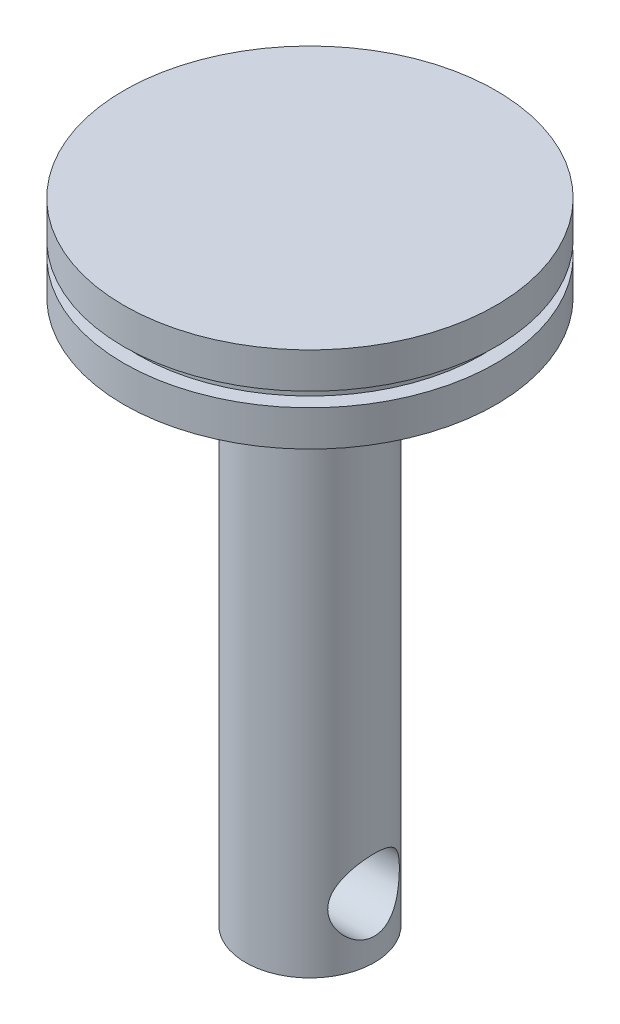
ISO-10303-21;
HEADER;
FILE_DESCRIPTION(('STEP AP214'),'2;1');
FILE_NAME('part.step','',(''),(''),'','','');
FILE_SCHEMA(('AUTOMOTIVE_DESIGN { 1 0 10303 214 1 1 1 1 }'));
ENDSEC;
DATA;
#1=APPLICATION_CONTEXT('core data for automotive mechanical design processes');
#2=APPLICATION_PROTOCOL_DEFINITION('international standard','automotive_design',2000,#1);
#3=PRODUCT_CONTEXT('',#1,'mechanical');
#4=PRODUCT('Part','Part','',(#3));
#5=PRODUCT_RELATED_PRODUCT_CATEGORY('part','',(#4));
#6=PRODUCT_DEFINITION_FORMATION('','',#4);
#7=PRODUCT_DEFINITION_CONTEXT('part definition',#1,'design');
#8=PRODUCT_DEFINITION('design','',#6,#7);
#9=PRODUCT_DEFINITION_SHAPE('','',#8);
#10=(LENGTH_UNIT() NAMED_UNIT(*) SI_UNIT(.MILLI.,.METRE.));
#11=(NAMED_UNIT(*) PLANE_ANGLE_UNIT() SI_UNIT($,.RADIAN.));
#12=(NAMED_UNIT(*) SI_UNIT($,.STERADIAN.) SOLID_ANGLE_UNIT());
#13=UNCERTAINTY_MEASURE_WITH_UNIT(LENGTH_MEASURE(1.E-05),#10,'distance_accuracy_value','');
#14=(GEOMETRIC_REPRESENTATION_CONTEXT(3) GLOBAL_UNCERTAINTY_ASSIGNED_CONTEXT((#13)) GLOBAL_UNIT_ASSIGNED_CONTEXT((#10,
#11,#12)) REPRESENTATION_CONTEXT('',''));
#15=CARTESIAN_POINT('',(0.,0.,0.));
#16=DIRECTION('',(0.,0.,1.));
#17=DIRECTION('',(1.,0.,0.));
#18=AXIS2_PLACEMENT_3D('',#15,#16,#17);
#19=CARTESIAN_POINT('',(0.,-33.9240072174427,0.));
#20=DIRECTION('',(0.,1.,0.));
#21=DIRECTION('',(0.,0.,1.));
#22=AXIS2_PLACEMENT_3D('',#19,#20,#21);
#23=CYLINDRICAL_SURFACE('',#22,4.5);
#24=CARTESIAN_POINT('',(0.,-41.9240072174427,0.));
#25=DIRECTION('',(0.,-1.,0.));
#26=DIRECTION('',(0.,0.,-1.));
#27=AXIS2_PLACEMENT_3D('',#24,#25,#26);
#28=CIRCLE('',#27,4.5);
#29=CARTESIAN_POINT('',(0.,-41.9240072174427,-4.5));
#30=VERTEX_POINT('',#29);
#31=EDGE_CURVE('E55',#30,#30,#28,.T.);
#32=ORIENTED_EDGE('',*,*,#31,.F.);
#33=EDGE_LOOP('',(#32));
#34=FACE_BOUND('',#33,.T.);
#35=CARTESIAN_POINT('',(3.74165738677394,-37.8240072174427,-2.5));
#36=CARTESIAN_POINT('',(3.7416726873018,-37.6961395570436,-2.4999886779506));
#37=CARTESIAN_POINT('',(3.74831704978973,-37.5681601848951,-2.49012046231189));
#38=CARTESIAN_POINT('',(3.77384839882003,-37.3163273203968,-2.45123834186473));
#39=CARTESIAN_POINT('',(3.7927555117257,-37.1924809633793,-2.42219296092694));
#40=CARTESIAN_POINT('',(3.83989933822706,-36.9530621004885,-2.34672518533575));
#41=CARTESIAN_POINT('',(3.86807667599456,-36.8374424908557,-2.30041313851033));
#42=CARTESIAN_POINT('',(3.93048941587976,-36.6156612164246,-2.19206578814093));
#43=CARTESIAN_POINT('',(3.96472616307529,-36.5095016594675,-2.13002699222232));
#44=CARTESIAN_POINT('',(4.03969403480013,-36.2975905020563,-1.98449846168224));
#45=CARTESIAN_POINT('',(4.08073069766828,-36.1930136394794,-1.89945493967149));
#46=CARTESIAN_POINT('',(4.16222299452639,-35.9986608869252,-1.71353751107972));
#47=CARTESIAN_POINT('',(4.20267825897363,-35.9088940607961,-1.61265398346238));
#48=CARTESIAN_POINT('',(4.28269640644694,-35.7389173849233,-1.3870985228492));
#49=CARTESIAN_POINT('',(4.3218664679031,-35.6602468877148,-1.26111369650509));
#50=CARTESIAN_POINT('',(4.39073714972017,-35.5257655540922,-0.995108431154295));
#51=CARTESIAN_POINT('',(4.4204451281028,-35.4699369454249,-0.855099010052982));
#52=CARTESIAN_POINT('',(4.46480622878589,-35.38770152924,-0.577542454411523));
#53=CARTESIAN_POINT('',(4.48051966286771,-35.3592066145069,-0.440787590455728));
#54=CARTESIAN_POINT('',(4.49916269482529,-35.3254727296973,-0.163616941001135));
#55=CARTESIAN_POINT('',(4.50210222637273,-35.3202156885494,-0.0232040856727892));
#56=CARTESIAN_POINT('',(4.4952695276662,-35.3325307137583,0.241178910719395));
#57=CARTESIAN_POINT('',(4.48682112148745,-35.3477250670809,0.365303845862469));
#58=CARTESIAN_POINT('',(4.46029652928146,-35.3961162207753,0.608906472500667));
#59=CARTESIAN_POINT('',(4.44221960111062,-35.4293144088436,0.728383805007819));
#60=CARTESIAN_POINT('',(4.39780601712422,-35.5127407223595,0.96097965319476));
#61=CARTESIAN_POINT('',(4.37138611834669,-35.5631409114613,1.07401990202965));
#62=CARTESIAN_POINT('',(4.31251997352908,-35.6791698325915,1.29025059849261));
#63=CARTESIAN_POINT('',(4.28007183515673,-35.7448033481499,1.39343793773988));
#64=CARTESIAN_POINT('',(4.20785286630511,-35.8976006789382,1.59909620965781));
#65=CARTESIAN_POINT('',(4.16766932048043,-35.9863332452798,1.70025747397735));
#66=CARTESIAN_POINT('',(4.08650106220151,-36.1786754863163,1.88703556620162));
#67=CARTESIAN_POINT('',(4.04551554284893,-36.2823008887471,1.97263574143215));
#68=CARTESIAN_POINT('',(3.96312397861105,-36.5129279257351,2.13367090095956));
#69=CARTESIAN_POINT('',(3.92201714941154,-36.6411974353891,2.2074790161184));
#70=CARTESIAN_POINT('',(3.86749177608975,-36.8433382095533,2.30082855027925));
#71=CARTESIAN_POINT('',(3.8505034104038,-36.9123543594318,2.32905476333226));
#72=CARTESIAN_POINT('',(3.81960529525348,-37.0532310078928,2.3793879141019));
#73=CARTESIAN_POINT('',(3.80569344305328,-37.1250895239277,2.4014990339696));
#74=CARTESIAN_POINT('',(3.7825660454845,-37.2652623945944,2.43774893725368));
#75=CARTESIAN_POINT('',(3.77306418691997,-37.3334015297041,2.45238335833743));
#76=CARTESIAN_POINT('',(3.75764870874585,-37.4710272751065,2.47593920496742));
#77=CARTESIAN_POINT('',(3.75173297653122,-37.5405130671281,2.48486399425826));
#78=CARTESIAN_POINT('',(3.7437735839187,-37.6801623820674,2.49684067369094));
#79=CARTESIAN_POINT('',(3.74172693637822,-37.750325340074,2.49989709455908));
#80=CARTESIAN_POINT('',(3.74159115846597,-37.890639330302,2.5000979353415));
#81=CARTESIAN_POINT('',(3.74350157370463,-37.9607903629677,2.49724303405302));
#82=CARTESIAN_POINT('',(3.75390669223115,-38.1492198810777,2.48160454093996));
#83=CARTESIAN_POINT('',(3.7660681233637,-38.2668923850021,2.46327912891111));
#84=CARTESIAN_POINT('',(3.79999671878864,-38.4970688492094,2.41059641135884));
#85=CARTESIAN_POINT('',(3.8217682717268,-38.609570422141,2.37623178080788));
#86=CARTESIAN_POINT('',(3.8734200279313,-38.8317490229989,2.29111009413922));
#87=CARTESIAN_POINT('',(3.90359765007498,-38.9411181431443,2.23973536116857));
#88=CARTESIAN_POINT('',(3.96852930897394,-39.1503329863458,2.12255957838161));
#89=CARTESIAN_POINT('',(4.00328557623677,-39.2501740266112,2.05675148683358));
#90=CARTESIAN_POINT('',(4.08021308062169,-39.4544978426964,1.90016864037281));
#91=CARTESIAN_POINT('',(4.12267224420938,-39.5571040431304,1.80707526767264));
#92=CARTESIAN_POINT('',(4.20557655948806,-39.7460065755287,1.60470900114283));
#93=CARTESIAN_POINT('',(4.24602045534201,-39.8322928288836,1.49542618309441));
#94=CARTESIAN_POINT('',(4.32300875493296,-39.9904401594782,1.25626042758287));
#95=CARTESIAN_POINT('',(4.3592262624207,-40.0612752936367,1.12558547217336));
#96=CARTESIAN_POINT('',(4.42090637895027,-40.1792035306309,0.851602165453134));
#97=CARTESIAN_POINT('',(4.44638033442814,-40.2263216915699,0.708307336575665));
#98=CARTESIAN_POINT('',(4.48148519912398,-40.2906549965625,0.42899010906301));
#99=CARTESIAN_POINT('',(4.49247473265288,-40.3104446397577,0.293732673237258));
#100=CARTESIAN_POINT('',(4.5020067452551,-40.327629618948,0.0213910904092903));
#101=CARTESIAN_POINT('',(4.50055608358422,-40.3250372958721,-0.115692008333063));
#102=CARTESIAN_POINT('',(4.48610175292531,-40.2989215921088,-0.374337460650785));
#103=CARTESIAN_POINT('',(4.47417531805916,-40.2773495756784,-0.49616574061533));
#104=CARTESIAN_POINT('',(4.44133257368086,-40.2169294998613,-0.734167155025522));
#105=CARTESIAN_POINT('',(4.42041521206198,-40.1780794185991,-0.850339625863899));
#106=CARTESIAN_POINT('',(4.37054329109129,-40.0830633418905,-1.07814775614309));
#107=CARTESIAN_POINT('',(4.34134725989101,-40.0263703932517,-1.18950897627403));
#108=CARTESIAN_POINT('',(4.27762772016495,-39.8979426400683,-1.40148896122862));
#109=CARTESIAN_POINT('',(4.24310211347579,-39.8262019074582,-1.50210346874527));
#110=CARTESIAN_POINT('',(4.16717195560101,-39.6601423971994,-1.7021791607781));
#111=CARTESIAN_POINT('',(4.12543450176894,-39.5641674438805,-1.8001424434206));
#112=CARTESIAN_POINT('',(4.04252541347579,-39.3573114005567,-1.97933250231108));
#113=CARTESIAN_POINT('',(4.0013545489803,-39.246411883079,-2.06053826881238));
#114=CARTESIAN_POINT('',(3.92122408482219,-39.0030065797889,-2.20944802239287));
#115=CARTESIAN_POINT('',(3.88262653031918,-38.8695276224798,-2.27579178691453));
#116=CARTESIAN_POINT('',(3.83343009045748,-38.6605338853563,-2.35707752273247));
#117=CARTESIAN_POINT('',(3.81848976926698,-38.589467298152,-2.3811224445757));
#118=CARTESIAN_POINT('',(3.79215325477146,-38.4448686169678,-2.42284599463621));
#119=CARTESIAN_POINT('',(3.78075483413815,-38.3713381047952,-2.44052862489737));
#120=CARTESIAN_POINT('',(3.7617084132447,-38.2194170917024,-2.4697920477666));
#121=CARTESIAN_POINT('',(3.75423236647764,-38.1409506958399,-2.48109451131779));
#122=CARTESIAN_POINT('',(3.74420222538488,-37.9830063053527,-2.49620181022554));
#123=CARTESIAN_POINT('',(3.74164787134588,-37.9035283643293,-2.50000704120456));
#124=CARTESIAN_POINT('',(3.74165738677394,-37.8240072174427,-2.5));
#125=B_SPLINE_CURVE_WITH_KNOTS('',3,(#35,#36,#37,#38,#39,#40,#41,#42,#43,#44,#45,#46,#47,#48,
#49,#50,#51,#52,#53,#54,#55,#56,#57,#58,#59,#60,#61,#62,#63,#64,#65,#66,#67,#68,#69,#70,#71,#72,
#73,#74,#75,#76,#77,#78,#79,#80,#81,#82,#83,#84,#85,#86,#87,#88,#89,#90,#91,#92,#93,#94,#95,#96,
#97,#98,#99,#100,#101,#102,#103,#104,#105,#106,#107,#108,#109,#110,#111,#112,#113,#114,#115,
#116,#117,#118,#119,#120,#121,#122,#123,#124),.UNSPECIFIED.,.T.,.F.,(4,2,2,2,2,2,2,2,2,2,2,2,2,
2,2,2,2,2,2,2,2,2,2,2,2,2,2,2,2,2,2,2,2,2,2,2,2,2,2,2,2,2,2,2,4),(0.,0.383275383121338,
0.76718141816575,1.14867490739205,1.53025318763779,1.95124472962169,2.37249297328884,
2.83086394113249,3.2888775896641,3.70817544329898,4.12714717001845,4.50138183787381,
4.87564535502261,5.25376784587462,5.63200923481063,6.05157027592399,6.47157769989119,
6.92969119559361,7.15882945779303,7.38781062115844,7.5985062155953,7.80907756727165,
8.01948627997721,8.22987083278616,8.58719279804063,8.94467811029152,9.31690871248925,
9.68932132373674,10.122176331063,10.5552977873492,11.0117233376161,11.4676656351332,
11.8767730047249,12.2856548158304,12.6568475822263,13.0280837969544,13.4115163637487,
13.7951002682315,14.2233400990621,14.6521136168463,15.1111969694139,15.3403711075502,
15.5694008362358,15.80777312205,16.0461328288286),.UNSPECIFIED.);
#126=CARTESIAN_POINT('',(3.74165738677394,-37.8240072174427,-2.5));
#127=VERTEX_POINT('',#126);
#128=EDGE_CURVE('E69',#127,#127,#125,.T.);
#129=ORIENTED_EDGE('',*,*,#128,.F.);
#130=EDGE_LOOP('',(#129));
#131=FACE_BOUND('',#130,.T.);
#132=CARTESIAN_POINT('',(-3.74165738677394,-37.8240072174427,-2.5));
#133=CARTESIAN_POINT('',(-3.7416726873018,-37.9518748778418,-2.4999886779506));
#134=CARTESIAN_POINT('',(-3.74831704978973,-38.0798542499903,-2.49012046231189));
#135=CARTESIAN_POINT('',(-3.77384839882003,-38.3316871144886,-2.45123834186473));
#136=CARTESIAN_POINT('',(-3.7927555117257,-38.4555334715061,-2.42219296092694));
#137=CARTESIAN_POINT('',(-3.83989933822706,-38.6949523343969,-2.34672518533575));
#138=CARTESIAN_POINT('',(-3.86807667599456,-38.8105719440297,-2.30041313851033));
#139=CARTESIAN_POINT('',(-3.93048941587976,-39.0323532184608,-2.19206578814093));
#140=CARTESIAN_POINT('',(-3.96472616307529,-39.1385127754179,-2.13002699222232));
#141=CARTESIAN_POINT('',(-4.03969403480013,-39.3504239328291,-1.98449846168224));
#142=CARTESIAN_POINT('',(-4.08073069766828,-39.455000795406,-1.89945493967149));
#143=CARTESIAN_POINT('',(-4.16222299452639,-39.6493535479602,-1.71353751107972));
#144=CARTESIAN_POINT('',(-4.20267825897363,-39.7391203740893,-1.61265398346238));
#145=CARTESIAN_POINT('',(-4.28269640644694,-39.9090970499621,-1.3870985228492));
#146=CARTESIAN_POINT('',(-4.3218664679031,-39.9877675471706,-1.26111369650509));
#147=CARTESIAN_POINT('',(-4.39073714972017,-40.1222488807932,-0.995108431154295));
#148=CARTESIAN_POINT('',(-4.4204451281028,-40.1780774894605,-0.855099010052982));
#149=CARTESIAN_POINT('',(-4.46480622878589,-40.2603129056454,-0.577542454411524));
#150=CARTESIAN_POINT('',(-4.48051966286771,-40.2888078203785,-0.440787590455729));
#151=CARTESIAN_POINT('',(-4.49916269482529,-40.3225417051881,-0.163616941001135));
#152=CARTESIAN_POINT('',(-4.50210222637274,-40.327798746336,-0.0232040856727894));
#153=CARTESIAN_POINT('',(-4.4952695276662,-40.3154837211271,0.241178910719395));
#154=CARTESIAN_POINT('',(-4.48682112148745,-40.3002893678045,0.365303845862469));
#155=CARTESIAN_POINT('',(-4.46029652928146,-40.2518982141101,0.608906472500667));
#156=CARTESIAN_POINT('',(-4.44221960111062,-40.2187000260418,0.728383805007819));
#157=CARTESIAN_POINT('',(-4.39780601712422,-40.1352737125259,0.96097965319476));
#158=CARTESIAN_POINT('',(-4.37138611834669,-40.0848735234241,1.07401990202965));
#159=CARTESIAN_POINT('',(-4.31251997352908,-39.9688446022939,1.29025059849261));
#160=CARTESIAN_POINT('',(-4.28007183515673,-39.9032110867355,1.39343793773988));
#161=CARTESIAN_POINT('',(-4.20785286630511,-39.7504137559472,1.59909620965781));
#162=CARTESIAN_POINT('',(-4.16766932048043,-39.6616811896056,1.70025747397735));
#163=CARTESIAN_POINT('',(-4.08650106220151,-39.4693389485691,1.88703556620162));
#164=CARTESIAN_POINT('',(-4.04551554284893,-39.3657135461383,1.97263574143215));
#165=CARTESIAN_POINT('',(-3.96312397861105,-39.1350865091503,2.13367090095956));
#166=CARTESIAN_POINT('',(-3.92201714941154,-39.0068169994963,2.2074790161184));
#167=CARTESIAN_POINT('',(-3.86749177608975,-38.8046762253321,2.30082855027925));
#168=CARTESIAN_POINT('',(-3.8505034104038,-38.7356600754536,2.32905476333226));
#169=CARTESIAN_POINT('',(-3.81960529525348,-38.5947834269926,2.3793879141019));
#170=CARTESIAN_POINT('',(-3.80569344305328,-38.5229249109577,2.4014990339696));
#171=CARTESIAN_POINT('',(-3.7825660454845,-38.382752040291,2.43774893725368));
#172=CARTESIAN_POINT('',(-3.77306418691998,-38.3146129051813,2.45238335833743));
#173=CARTESIAN_POINT('',(-3.75764870874585,-38.1769871597789,2.47593920496742));
#174=CARTESIAN_POINT('',(-3.75173297653122,-38.1075013677573,2.48486399425826));
#175=CARTESIAN_POINT('',(-3.7437735839187,-37.967852052818,2.49684067369094));
#176=CARTESIAN_POINT('',(-3.74172693637822,-37.8976890948114,2.49989709455908));
#177=CARTESIAN_POINT('',(-3.74159115846598,-37.7573751045834,2.5000979353415));
#178=CARTESIAN_POINT('',(-3.74350157370463,-37.6872240719177,2.49724303405302));
#179=CARTESIAN_POINT('',(-3.75390669223115,-37.4987945538077,2.48160454093996));
#180=CARTESIAN_POINT('',(-3.7660681233637,-37.3811220498833,2.46327912891111));
#181=CARTESIAN_POINT('',(-3.79999671878864,-37.150945585676,2.41059641135884));
#182=CARTESIAN_POINT('',(-3.8217682717268,-37.0384440127444,2.37623178080788));
#183=CARTESIAN_POINT('',(-3.8734200279313,-36.8162654118865,2.29111009413922));
#184=CARTESIAN_POINT('',(-3.90359765007498,-36.7068962917411,2.23973536116857));
#185=CARTESIAN_POINT('',(-3.96852930897394,-36.4976814485396,2.12255957838161));
#186=CARTESIAN_POINT('',(-4.00328557623677,-36.3978404082742,2.05675148683358));
#187=CARTESIAN_POINT('',(-4.08021308062169,-36.193516592189,1.90016864037281));
#188=CARTESIAN_POINT('',(-4.12267224420938,-36.090910391755,1.80707526767264));
#189=CARTESIAN_POINT('',(-4.20557655948806,-35.9020078593567,1.60470900114283));
#190=CARTESIAN_POINT('',(-4.24602045534201,-35.8157216060018,1.49542618309441));
#191=CARTESIAN_POINT('',(-4.32300875493296,-35.6575742754072,1.25626042758287));
#192=CARTESIAN_POINT('',(-4.3592262624207,-35.5867391412487,1.12558547217336));
#193=CARTESIAN_POINT('',(-4.42090637895027,-35.4688109042545,0.851602165453132));
#194=CARTESIAN_POINT('',(-4.44638033442814,-35.4216927433155,0.708307336575663));
#195=CARTESIAN_POINT('',(-4.48148519912398,-35.3573594383229,0.42899010906301));
#196=CARTESIAN_POINT('',(-4.49247473265288,-35.3375697951277,0.293732673237258));
#197=CARTESIAN_POINT('',(-4.5020067452551,-35.3203848159374,0.0213910904092904));
#198=CARTESIAN_POINT('',(-4.50055608358422,-35.3229771390133,-0.115692008333063));
#199=CARTESIAN_POINT('',(-4.48610175292531,-35.3490928427766,-0.374337460650785));
#200=CARTESIAN_POINT('',(-4.47417531805916,-35.370664859207,-0.49616574061533));
#201=CARTESIAN_POINT('',(-4.44133257368086,-35.4310849350241,-0.734167155025522));
#202=CARTESIAN_POINT('',(-4.42041521206198,-35.4699350162863,-0.850339625863899));
#203=CARTESIAN_POINT('',(-4.37054329109129,-35.5649510929949,-1.07814775614309));
#204=CARTESIAN_POINT('',(-4.34134725989101,-35.6216440416337,-1.18950897627403));
#205=CARTESIAN_POINT('',(-4.27762772016495,-35.7500717948171,-1.40148896122862));
#206=CARTESIAN_POINT('',(-4.24310211347579,-35.8218125274272,-1.50210346874527));
#207=CARTESIAN_POINT('',(-4.16717195560101,-35.987872037686,-1.7021791607781));
#208=CARTESIAN_POINT('',(-4.12543450176894,-36.0838469910049,-1.8001424434206));
#209=CARTESIAN_POINT('',(-4.04252541347578,-36.2907030343287,-1.97933250231108));
#210=CARTESIAN_POINT('',(-4.0013545489803,-36.4016025518064,-2.06053826881238));
#211=CARTESIAN_POINT('',(-3.92122408482219,-36.6450078550965,-2.20944802239287));
#212=CARTESIAN_POINT('',(-3.88262653031918,-36.7784868124057,-2.27579178691453));
#213=CARTESIAN_POINT('',(-3.83343009045748,-36.9874805495291,-2.35707752273247));
#214=CARTESIAN_POINT('',(-3.81848976926698,-37.0585471367334,-2.3811224445757));
#215=CARTESIAN_POINT('',(-3.79215325477146,-37.2031458179176,-2.42284599463621));
#216=CARTESIAN_POINT('',(-3.78075483413815,-37.2766763300902,-2.44052862489737));
#217=CARTESIAN_POINT('',(-3.7617084132447,-37.428597343183,-2.4697920477666));
#218=CARTESIAN_POINT('',(-3.75423236647764,-37.5070637390455,-2.48109451131779));
#219=CARTESIAN_POINT('',(-3.74420222538488,-37.6650081295327,-2.49620181022554));
#220=CARTESIAN_POINT('',(-3.74164787134588,-37.7444860705561,-2.50000704120456));
#221=CARTESIAN_POINT('',(-3.74165738677394,-37.8240072174427,-2.5));
#222=B_SPLINE_CURVE_WITH_KNOTS('',3,(#132,#133,#134,#135,#136,#137,#138,#139,#140,#141,#142,
#143,#144,#145,#146,#147,#148,#149,#150,#151,#152,#153,#154,#155,#156,#157,#158,#159,#160,#161,
#162,#163,#164,#165,#166,#167,#168,#169,#170,#171,#172,#173,#174,#175,#176,#177,#178,#179,#180,
#181,#182,#183,#184,#185,#186,#187,#188,#189,#190,#191,#192,#193,#194,#195,#196,#197,#198,#199,
#200,#201,#202,#203,#204,#205,#206,#207,#208,#209,#210,#211,#212,#213,#214,#215,#216,#217,#218,
#219,#220,#221),.UNSPECIFIED.,.T.,.F.,(4,2,2,2,2,2,2,2,2,2,2,2,2,2,2,2,2,2,2,2,2,2,2,2,2,2,2,2,
2,2,2,2,2,2,2,2,2,2,2,2,2,2,2,2,4),(0.,0.383275383121338,0.76718141816575,1.14867490739205,
1.53025318763779,1.95124472962169,2.37249297328884,2.83086394113249,3.2888775896641,
3.70817544329898,4.12714717001845,4.50138183787381,4.87564535502261,5.25376784587462,
5.63200923481063,6.05157027592398,6.47157769989119,6.92969119559361,7.15882945779303,
7.38781062115844,7.59850621559528,7.80907756727165,8.01948627997722,8.22987083278616,
8.58719279804062,8.94467811029152,9.31690871248924,9.68932132373674,10.122176331063,
10.5552977873492,11.0117233376161,11.4676656351332,11.8767730047249,12.2856548158304,
12.6568475822263,13.0280837969544,13.4115163637487,13.7951002682315,14.2233400990621,
14.6521136168463,15.1111969694139,15.3403711075502,15.5694008362358,15.80777312205,
16.0461328288286),.UNSPECIFIED.);
#223=CARTESIAN_POINT('',(-3.74165738677394,-37.8240072174427,-2.5));
#224=VERTEX_POINT('',#223);
#225=EDGE_CURVE('E37',#224,#224,#222,.T.);
#226=ORIENTED_EDGE('',*,*,#225,.F.);
#227=EDGE_LOOP('',(#226));
#228=FACE_BOUND('',#227,.T.);
#229=CARTESIAN_POINT('',(0.,-3.9240072174427,0.));
#230=DIRECTION('',(0.,-1.,0.));
#231=DIRECTION('',(0.,0.,-1.));
#232=AXIS2_PLACEMENT_3D('',#229,#230,#231);
#233=CIRCLE('',#232,4.5);
#234=CARTESIAN_POINT('',(0.,-3.9240072174427,-4.5));
#235=VERTEX_POINT('',#234);
#236=EDGE_CURVE('E10',#235,#235,#233,.T.);
#237=ORIENTED_EDGE('',*,*,#236,.T.);
#238=EDGE_LOOP('',(#237));
#239=FACE_BOUND('',#238,.T.);
#240=ADVANCED_FACE('F33',(#34,#131,#228,#239),#23,.T.);
#241=CARTESIAN_POINT('',(0.,2.0759927825573,0.));
#242=DIRECTION('',(0.,-1.,0.));
#243=DIRECTION('',(0.,0.,-1.));
#244=AXIS2_PLACEMENT_3D('',#241,#242,#243);
#245=PLANE('',#244);
#246=CARTESIAN_POINT('',(0.,2.0759927825573,0.));
#247=DIRECTION('',(0.,1.,0.));
#248=DIRECTION('',(0.,0.,1.));
#249=AXIS2_PLACEMENT_3D('',#246,#247,#248);
#250=CIRCLE('',#249,13.);
#251=CARTESIAN_POINT('',(0.,2.0759927825573,13.));
#252=VERTEX_POINT('',#251);
#253=EDGE_CURVE('E46',#252,#252,#250,.T.);
#254=ORIENTED_EDGE('',*,*,#253,.T.);
#255=EDGE_LOOP('',(#254));
#256=FACE_BOUND('',#255,.T.);
#257=ADVANCED_FACE('F35',(#256),#245,.F.);
#258=CARTESIAN_POINT('',(0.,49.3119209927505,0.));
#259=DIRECTION('',(0.,1.,0.));
#260=DIRECTION('',(0.,0.,1.));
#261=AXIS2_PLACEMENT_3D('',#258,#259,#260);
#262=CYLINDRICAL_SURFACE('',#261,13.);
#263=ORIENTED_EDGE('',*,*,#253,.F.);
#264=EDGE_LOOP('',(#263));
#265=FACE_BOUND('',#264,.T.);
#266=CARTESIAN_POINT('',(0.,-0.4240072174427,0.));
#267=DIRECTION('',(0.,1.,0.));
#268=DIRECTION('',(0.,0.,1.));
#269=AXIS2_PLACEMENT_3D('',#266,#267,#268);
#270=CIRCLE('',#269,13.);
#271=CARTESIAN_POINT('',(0.,-0.4240072174427,13.));
#272=VERTEX_POINT('',#271);
#273=EDGE_CURVE('E51',#272,#272,#270,.T.);
#274=ORIENTED_EDGE('',*,*,#273,.T.);
#275=EDGE_LOOP('',(#274));
#276=FACE_BOUND('',#275,.T.);
#277=ADVANCED_FACE('F97',(#265,#276),#262,.T.);
#278=CARTESIAN_POINT('',(12.,-0.424007217442703,0.));
#279=DIRECTION('',(0.,1.,0.));
#280=DIRECTION('',(0.,0.,1.));
#281=AXIS2_PLACEMENT_3D('',#278,#279,#280);
#282=PLANE('',#281);
#283=ORIENTED_EDGE('',*,*,#273,.F.);
#284=EDGE_LOOP('',(#283));
#285=FACE_BOUND('',#284,.T.);
#286=CARTESIAN_POINT('',(0.,-0.4240072174427,0.));
#287=DIRECTION('',(0.,1.,0.));
#288=DIRECTION('',(0.,0.,1.));
#289=AXIS2_PLACEMENT_3D('',#286,#287,#288);
#290=CIRCLE('',#289,12.);
#291=CARTESIAN_POINT('',(0.,-0.4240072174427,12.));
#292=VERTEX_POINT('',#291);
#293=EDGE_CURVE('E65',#292,#292,#290,.T.);
#294=ORIENTED_EDGE('',*,*,#293,.T.);
#295=EDGE_LOOP('',(#294));
#296=FACE_BOUND('',#295,.T.);
#297=ADVANCED_FACE('F109',(#285,#296),#282,.F.);
#298=CARTESIAN_POINT('',(0.,49.3119209927505,0.));
#299=DIRECTION('',(0.,1.,0.));
#300=DIRECTION('',(0.,0.,1.));
#301=AXIS2_PLACEMENT_3D('',#298,#299,#300);
#302=CYLINDRICAL_SURFACE('',#301,12.);
#303=ORIENTED_EDGE('',*,*,#293,.F.);
#304=EDGE_LOOP('',(#303));
#305=FACE_BOUND('',#304,.T.);
#306=CARTESIAN_POINT('',(0.,-1.4240072174427,0.));
#307=DIRECTION('',(0.,1.,0.));
#308=DIRECTION('',(0.,0.,1.));
#309=AXIS2_PLACEMENT_3D('',#306,#307,#308);
#310=CIRCLE('',#309,12.);
#311=CARTESIAN_POINT('',(0.,-1.4240072174427,12.));
#312=VERTEX_POINT('',#311);
#313=EDGE_CURVE('E62',#312,#312,#310,.T.);
#314=ORIENTED_EDGE('',*,*,#313,.T.);
#315=EDGE_LOOP('',(#314));
#316=FACE_BOUND('',#315,.T.);
#317=ADVANCED_FACE('F117',(#305,#316),#302,.T.);
#318=CARTESIAN_POINT('',(13.,-1.4240072174427,0.));
#319=DIRECTION('',(0.,-1.,0.));
#320=DIRECTION('',(0.,0.,-1.));
#321=AXIS2_PLACEMENT_3D('',#318,#319,#320);
#322=PLANE('',#321);
#323=ORIENTED_EDGE('',*,*,#313,.F.);
#324=EDGE_LOOP('',(#323));
#325=FACE_BOUND('',#324,.T.);
#326=CARTESIAN_POINT('',(0.,-1.4240072174427,0.));
#327=DIRECTION('',(0.,1.,0.));
#328=DIRECTION('',(0.,0.,1.));
#329=AXIS2_PLACEMENT_3D('',#326,#327,#328);
#330=CIRCLE('',#329,13.);
#331=CARTESIAN_POINT('',(0.,-1.4240072174427,13.));
#332=VERTEX_POINT('',#331);
#333=EDGE_CURVE('E59',#332,#332,#330,.T.);
#334=ORIENTED_EDGE('',*,*,#333,.T.);
#335=EDGE_LOOP('',(#334));
#336=FACE_BOUND('',#335,.T.);
#337=ADVANCED_FACE('F123',(#325,#336),#322,.F.);
#338=CARTESIAN_POINT('',(0.,49.3119209927505,0.));
#339=DIRECTION('',(0.,1.,0.));
#340=DIRECTION('',(0.,0.,1.));
#341=AXIS2_PLACEMENT_3D('',#338,#339,#340);
#342=CYLINDRICAL_SURFACE('',#341,13.);
#343=ORIENTED_EDGE('',*,*,#333,.F.);
#344=EDGE_LOOP('',(#343));
#345=FACE_BOUND('',#344,.T.);
#346=CARTESIAN_POINT('',(0.,-3.9240072174427,0.));
#347=DIRECTION('',(0.,1.,0.));
#348=DIRECTION('',(0.,0.,1.));
#349=AXIS2_PLACEMENT_3D('',#346,#347,#348);
#350=CIRCLE('',#349,13.);
#351=CARTESIAN_POINT('',(0.,-3.9240072174427,13.));
#352=VERTEX_POINT('',#351);
#353=EDGE_CURVE('E56',#352,#352,#350,.T.);
#354=ORIENTED_EDGE('',*,*,#353,.T.);
#355=EDGE_LOOP('',(#354));
#356=FACE_BOUND('',#355,.T.);
#357=ADVANCED_FACE('F89',(#345,#356),#342,.T.);
#358=CARTESIAN_POINT('',(13.,-3.9240072174427,0.));
#359=DIRECTION('',(0.,1.,0.));
#360=DIRECTION('',(0.,0.,1.));
#361=AXIS2_PLACEMENT_3D('',#358,#359,#360);
#362=PLANE('',#361);
#363=ORIENTED_EDGE('',*,*,#236,.F.);
#364=EDGE_LOOP('',(#363));
#365=FACE_BOUND('',#364,.T.);
#366=ORIENTED_EDGE('',*,*,#353,.F.);
#367=EDGE_LOOP('',(#366));
#368=FACE_BOUND('',#367,.T.);
#369=ADVANCED_FACE('F84',(#365,#368),#362,.F.);
#370=CARTESIAN_POINT('',(0.,-41.9240072174427,0.));
#371=DIRECTION('',(0.,-1.,0.));
#372=DIRECTION('',(0.,0.,-1.));
#373=AXIS2_PLACEMENT_3D('',#370,#371,#372);
#374=PLANE('',#373);
#375=ORIENTED_EDGE('',*,*,#31,.T.);
#376=EDGE_LOOP('',(#375));
#377=FACE_BOUND('',#376,.T.);
#378=ADVANCED_FACE('F80',(#377),#374,.T.);
#379=CARTESIAN_POINT('',(-9.,-37.8240072174427,0.));
#380=DIRECTION('',(1.,0.,0.));
#381=DIRECTION('',(0.,0.,-1.));
#382=AXIS2_PLACEMENT_3D('',#379,#380,#381);
#383=CYLINDRICAL_SURFACE('',#382,2.5);
#384=ORIENTED_EDGE('',*,*,#128,.T.);
#385=EDGE_LOOP('',(#384));
#386=FACE_BOUND('',#385,.T.);
#387=ORIENTED_EDGE('',*,*,#225,.T.);
#388=EDGE_LOOP('',(#387));
#389=FACE_BOUND('',#388,.T.);
#390=ADVANCED_FACE('F77',(#386,#389),#383,.F.);
#391=CLOSED_SHELL('',(#240,#257,#277,#297,#317,#337,#357,#369,#378,#390));
#392=MANIFOLD_SOLID_BREP('B2',#391);
#393=ADVANCED_BREP_SHAPE_REPRESENTATION('',(#18,#392),#14);
#394=SHAPE_DEFINITION_REPRESENTATION(#9,#393);
ENDSEC;
END-ISO-10303-21;
